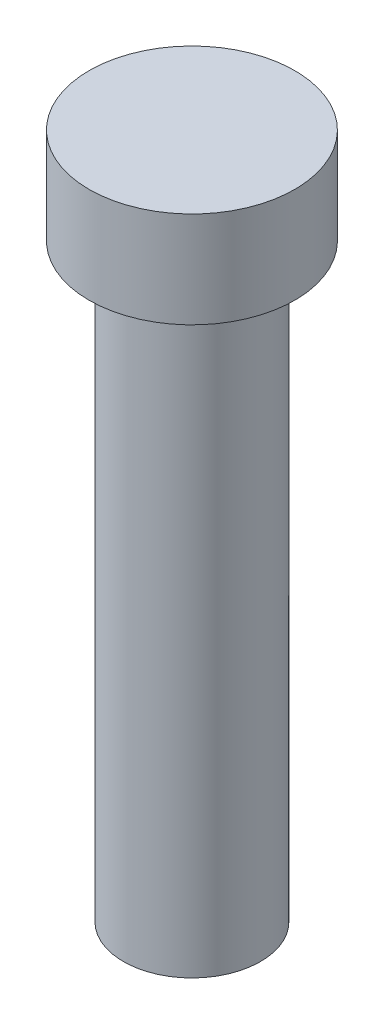
ISO-10303-21;
HEADER;
FILE_DESCRIPTION(('STEP AP214'),'2;1');
FILE_NAME('part.step','',(''),(''),'','','');
FILE_SCHEMA(('AUTOMOTIVE_DESIGN { 1 0 10303 214 1 1 1 1 }'));
ENDSEC;
DATA;
#1=APPLICATION_CONTEXT('core data for automotive mechanical design processes');
#2=APPLICATION_PROTOCOL_DEFINITION('international standard','automotive_design',2000,#1);
#3=PRODUCT_CONTEXT('',#1,'mechanical');
#4=PRODUCT('Part','Part','',(#3));
#5=PRODUCT_RELATED_PRODUCT_CATEGORY('part','',(#4));
#6=PRODUCT_DEFINITION_FORMATION('','',#4);
#7=PRODUCT_DEFINITION_CONTEXT('part definition',#1,'design');
#8=PRODUCT_DEFINITION('design','',#6,#7);
#9=PRODUCT_DEFINITION_SHAPE('','',#8);
#10=(LENGTH_UNIT() NAMED_UNIT(*) SI_UNIT(.MILLI.,.METRE.));
#11=(NAMED_UNIT(*) PLANE_ANGLE_UNIT() SI_UNIT($,.RADIAN.));
#12=(NAMED_UNIT(*) SI_UNIT($,.STERADIAN.) SOLID_ANGLE_UNIT());
#13=UNCERTAINTY_MEASURE_WITH_UNIT(LENGTH_MEASURE(1.E-05),#10,'distance_accuracy_value','');
#14=(GEOMETRIC_REPRESENTATION_CONTEXT(3) GLOBAL_UNCERTAINTY_ASSIGNED_CONTEXT((#13)) GLOBAL_UNIT_ASSIGNED_CONTEXT((#10,
#11,#12)) REPRESENTATION_CONTEXT('',''));
#15=CARTESIAN_POINT('',(0.,0.,0.));
#16=DIRECTION('',(0.,0.,1.));
#17=DIRECTION('',(1.,0.,0.));
#18=AXIS2_PLACEMENT_3D('',#15,#16,#17);
#19=CARTESIAN_POINT('',(0.,7.,0.));
#20=DIRECTION('',(0.,-1.,0.));
#21=DIRECTION('',(0.,0.,-1.));
#22=AXIS2_PLACEMENT_3D('',#19,#20,#21);
#23=CYLINDRICAL_SURFACE('',#22,7.5);
#24=CARTESIAN_POINT('',(0.,7.,0.));
#25=DIRECTION('',(0.,1.,0.));
#26=DIRECTION('',(0.,0.,1.));
#27=AXIS2_PLACEMENT_3D('',#24,#25,#26);
#28=CIRCLE('',#27,7.5);
#29=CARTESIAN_POINT('',(0.,7.,7.5));
#30=VERTEX_POINT('',#29);
#31=EDGE_CURVE('E42',#30,#30,#28,.T.);
#32=ORIENTED_EDGE('',*,*,#31,.F.);
#33=EDGE_LOOP('',(#32));
#34=FACE_BOUND('',#33,.T.);
#35=CARTESIAN_POINT('',(0.,0.,0.));
#36=DIRECTION('',(0.,1.,0.));
#37=DIRECTION('',(0.,0.,1.));
#38=AXIS2_PLACEMENT_3D('',#35,#36,#37);
#39=CIRCLE('',#38,7.5);
#40=CARTESIAN_POINT('',(0.,0.,7.5));
#41=VERTEX_POINT('',#40);
#42=EDGE_CURVE('E38',#41,#41,#39,.T.);
#43=ORIENTED_EDGE('',*,*,#42,.T.);
#44=EDGE_LOOP('',(#43));
#45=FACE_BOUND('',#44,.T.);
#46=ADVANCED_FACE('F35',(#34,#45),#23,.T.);
#47=CARTESIAN_POINT('',(0.,7.,0.));
#48=DIRECTION('',(0.,1.,0.));
#49=DIRECTION('',(0.,0.,1.));
#50=AXIS2_PLACEMENT_3D('',#47,#48,#49);
#51=PLANE('',#50);
#52=ORIENTED_EDGE('',*,*,#31,.T.);
#53=EDGE_LOOP('',(#52));
#54=FACE_BOUND('',#53,.T.);
#55=ADVANCED_FACE('F59',(#54),#51,.T.);
#56=CARTESIAN_POINT('',(0.,0.,0.));
#57=DIRECTION('',(0.,1.,0.));
#58=DIRECTION('',(0.,0.,1.));
#59=AXIS2_PLACEMENT_3D('',#56,#57,#58);
#60=PLANE('',#59);
#61=CARTESIAN_POINT('',(0.,0.,0.));
#62=DIRECTION('',(0.,-1.,0.));
#63=DIRECTION('',(0.,0.,-1.));
#64=AXIS2_PLACEMENT_3D('',#61,#62,#63);
#65=CIRCLE('',#64,5.);
#66=CARTESIAN_POINT('',(0.,0.,-5.));
#67=VERTEX_POINT('',#66);
#68=EDGE_CURVE('E10',#67,#67,#65,.T.);
#69=ORIENTED_EDGE('',*,*,#68,.F.);
#70=EDGE_LOOP('',(#69));
#71=FACE_BOUND('',#70,.T.);
#72=ORIENTED_EDGE('',*,*,#42,.F.);
#73=EDGE_LOOP('',(#72));
#74=FACE_BOUND('',#73,.T.);
#75=ADVANCED_FACE('F56',(#71,#74),#60,.F.);
#76=CARTESIAN_POINT('',(0.,-43.,0.));
#77=DIRECTION('',(0.,1.,0.));
#78=DIRECTION('',(0.,0.,1.));
#79=AXIS2_PLACEMENT_3D('',#76,#77,#78);
#80=CYLINDRICAL_SURFACE('',#79,5.);
#81=CARTESIAN_POINT('',(0.,-43.,0.));
#82=DIRECTION('',(0.,-1.,0.));
#83=DIRECTION('',(0.,0.,-1.));
#84=AXIS2_PLACEMENT_3D('',#81,#82,#83);
#85=CIRCLE('',#84,5.);
#86=CARTESIAN_POINT('',(0.,-43.,-5.));
#87=VERTEX_POINT('',#86);
#88=EDGE_CURVE('E48',#87,#87,#85,.T.);
#89=ORIENTED_EDGE('',*,*,#88,.F.);
#90=EDGE_LOOP('',(#89));
#91=FACE_BOUND('',#90,.T.);
#92=ORIENTED_EDGE('',*,*,#68,.T.);
#93=EDGE_LOOP('',(#92));
#94=FACE_BOUND('',#93,.T.);
#95=ADVANCED_FACE('F58',(#91,#94),#80,.T.);
#96=CARTESIAN_POINT('',(0.,-43.,0.));
#97=DIRECTION('',(0.,-1.,0.));
#98=DIRECTION('',(0.,0.,-1.));
#99=AXIS2_PLACEMENT_3D('',#96,#97,#98);
#100=PLANE('',#99);
#101=ORIENTED_EDGE('',*,*,#88,.T.);
#102=EDGE_LOOP('',(#101));
#103=FACE_BOUND('',#102,.T.);
#104=ADVANCED_FACE('F65',(#103),#100,.T.);
#105=CLOSED_SHELL('',(#46,#55,#75,#95,#104));
#106=MANIFOLD_SOLID_BREP('B2',#105);
#107=ADVANCED_BREP_SHAPE_REPRESENTATION('',(#18,#106),#14);
#108=SHAPE_DEFINITION_REPRESENTATION(#9,#107);
ENDSEC;
END-ISO-10303-21;
